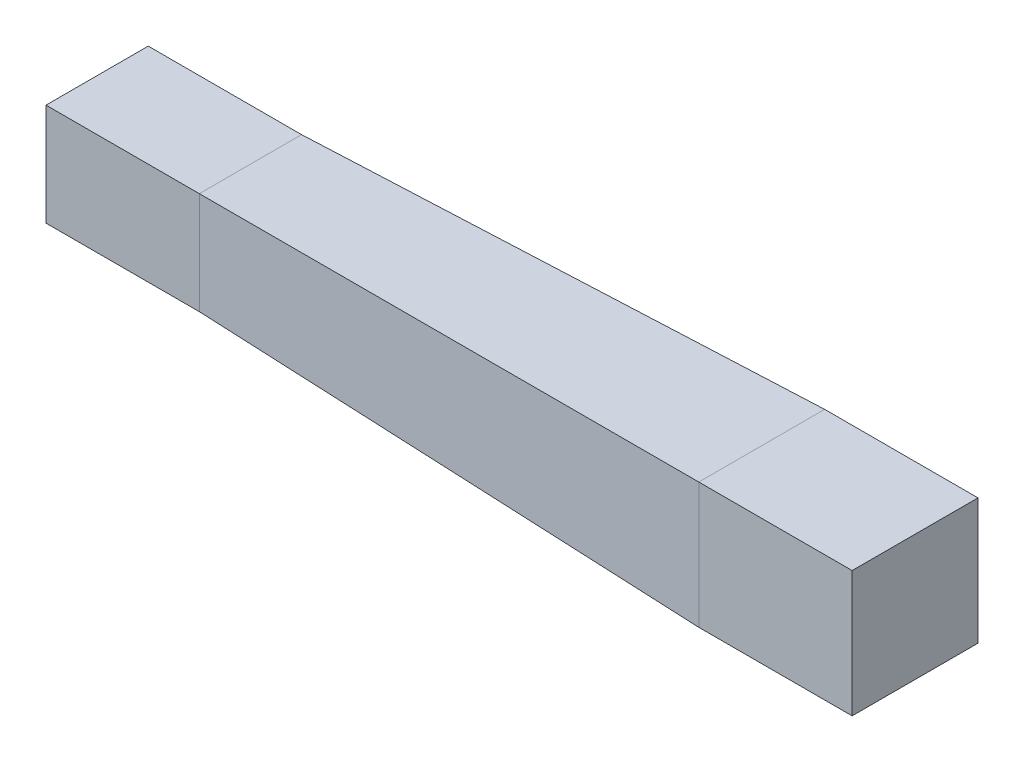
ISO-10303-21;
HEADER;
FILE_DESCRIPTION(('STEP AP214'),'2;1');
FILE_NAME('part.step','',(''),(''),'','','');
FILE_SCHEMA(('AUTOMOTIVE_DESIGN { 1 0 10303 214 1 1 1 1 }'));
ENDSEC;
DATA;
#1=APPLICATION_CONTEXT('core data for automotive mechanical design processes');
#2=APPLICATION_PROTOCOL_DEFINITION('international standard','automotive_design',2000,#1);
#3=PRODUCT_CONTEXT('',#1,'mechanical');
#4=PRODUCT('Part','Part','',(#3));
#5=PRODUCT_RELATED_PRODUCT_CATEGORY('part','',(#4));
#6=PRODUCT_DEFINITION_FORMATION('','',#4);
#7=PRODUCT_DEFINITION_CONTEXT('part definition',#1,'design');
#8=PRODUCT_DEFINITION('design','',#6,#7);
#9=PRODUCT_DEFINITION_SHAPE('','',#8);
#10=(LENGTH_UNIT() NAMED_UNIT(*) SI_UNIT(.MILLI.,.METRE.));
#11=(NAMED_UNIT(*) PLANE_ANGLE_UNIT() SI_UNIT($,.RADIAN.));
#12=(NAMED_UNIT(*) SI_UNIT($,.STERADIAN.) SOLID_ANGLE_UNIT());
#13=UNCERTAINTY_MEASURE_WITH_UNIT(LENGTH_MEASURE(1.E-05),#10,'distance_accuracy_value','');
#14=(GEOMETRIC_REPRESENTATION_CONTEXT(3) GLOBAL_UNCERTAINTY_ASSIGNED_CONTEXT((#13)) GLOBAL_UNIT_ASSIGNED_CONTEXT((#10,
#11,#12)) REPRESENTATION_CONTEXT('',''));
#15=CARTESIAN_POINT('',(0.,0.,0.));
#16=DIRECTION('',(0.,0.,1.));
#17=DIRECTION('',(1.,0.,0.));
#18=AXIS2_PLACEMENT_3D('',#15,#16,#17);
#19=CARTESIAN_POINT('',(1020.85832331262,125.73,125.73));
#20=DIRECTION('',(-0.0231200092502085,0.999732696860651,0.));
#21=DIRECTION('',(0.,0.,-1.));
#22=AXIS2_PLACEMENT_3D('',#19,#20,#21);
#23=PLANE('',#22);
#24=DIRECTION('',(0.,0.,1.));
#25=VECTOR('',#24,1.);
#26=CARTESIAN_POINT('',(1020.85832331262,125.73,125.73));
#27=LINE('',#26,#25);
#28=CARTESIAN_POINT('',(1020.85832331262,125.73,-125.73));
#29=VERTEX_POINT('',#28);
#30=CARTESIAN_POINT('',(1020.85832331262,125.73,125.73));
#31=VERTEX_POINT('',#30);
#32=EDGE_CURVE('E320',#29,#31,#27,.T.);
#33=ORIENTED_EDGE('',*,*,#32,.F.);
#34=CARTESIAN_POINT('',(1020.85832331262,125.73,-125.73));
#35=CARTESIAN_POINT('',(680.378560960894,117.856,-117.856));
#36=CARTESIAN_POINT('',(339.898798609163,109.982,-109.982));
#37=CARTESIAN_POINT('',(-0.580963742567401,102.108,-102.108));
#38=B_SPLINE_CURVE_WITH_KNOTS('',3,(#34,#35,#36,#37),.UNSPECIFIED.,.F.,.F.,(4,4),(0.,1.),.UNSPECIFIED.);
#39=CARTESIAN_POINT('',(-0.580963742567401,102.108,-102.108));
#40=VERTEX_POINT('',#39);
#41=EDGE_CURVE('E248',#29,#40,#38,.T.);
#42=ORIENTED_EDGE('',*,*,#41,.T.);
#43=DIRECTION('',(0.,0.,1.));
#44=VECTOR('',#43,1.);
#45=CARTESIAN_POINT('',(-0.580963742567401,102.108,102.108));
#46=LINE('',#45,#44);
#47=CARTESIAN_POINT('',(-0.580963742567401,102.108,102.108));
#48=VERTEX_POINT('',#47);
#49=EDGE_CURVE('E190',#40,#48,#46,.T.);
#50=ORIENTED_EDGE('',*,*,#49,.T.);
#51=CARTESIAN_POINT('',(1020.85832331262,125.73,125.73));
#52=CARTESIAN_POINT('',(680.378560960894,117.856,117.856));
#53=CARTESIAN_POINT('',(339.898798609163,109.982,109.982));
#54=CARTESIAN_POINT('',(-0.580963742567401,102.108,102.108));
#55=B_SPLINE_CURVE_WITH_KNOTS('',3,(#51,#52,#53,#54),.UNSPECIFIED.,.F.,.F.,(4,4),(0.,1.),.UNSPECIFIED.);
#56=EDGE_CURVE('E239',#31,#48,#55,.T.);
#57=ORIENTED_EDGE('',*,*,#56,.F.);
#58=EDGE_LOOP('',(#33,#42,#50,#57));
#59=FACE_BOUND('',#58,.T.);
#60=ADVANCED_FACE('F115',(#59),#23,.T.);
#61=CARTESIAN_POINT('',(1020.85832331262,-125.73,125.73));
#62=DIRECTION('',(-0.0231200092502084,0.,0.999732696860651));
#63=DIRECTION('',(0.,1.,0.));
#64=AXIS2_PLACEMENT_3D('',#61,#62,#63);
#65=PLANE('',#64);
#66=DIRECTION('',(0.,-1.,0.));
#67=VECTOR('',#66,1.);
#68=CARTESIAN_POINT('',(1020.85832331262,-125.73,125.73));
#69=LINE('',#68,#67);
#70=CARTESIAN_POINT('',(1020.85832331262,-125.73,125.73));
#71=VERTEX_POINT('',#70);
#72=EDGE_CURVE('E141',#31,#71,#69,.T.);
#73=ORIENTED_EDGE('',*,*,#72,.F.);
#74=ORIENTED_EDGE('',*,*,#56,.T.);
#75=DIRECTION('',(0.,-1.,0.));
#76=VECTOR('',#75,1.);
#77=CARTESIAN_POINT('',(-0.580963742567401,-102.108,102.108));
#78=LINE('',#77,#76);
#79=CARTESIAN_POINT('',(-0.580963742567401,-102.108,102.108));
#80=VERTEX_POINT('',#79);
#81=EDGE_CURVE('E120',#48,#80,#78,.T.);
#82=ORIENTED_EDGE('',*,*,#81,.T.);
#83=CARTESIAN_POINT('',(1020.85832331262,-125.73,125.73));
#84=CARTESIAN_POINT('',(680.378560960894,-117.856,117.856));
#85=CARTESIAN_POINT('',(339.898798609163,-109.982,109.982));
#86=CARTESIAN_POINT('',(-0.580963742567401,-102.108,102.108));
#87=B_SPLINE_CURVE_WITH_KNOTS('',3,(#83,#84,#85,#86),.UNSPECIFIED.,.F.,.F.,(4,4),(0.,1.),.UNSPECIFIED.);
#88=EDGE_CURVE('E228',#71,#80,#87,.T.);
#89=ORIENTED_EDGE('',*,*,#88,.F.);
#90=EDGE_LOOP('',(#73,#74,#82,#89));
#91=FACE_BOUND('',#90,.T.);
#92=ADVANCED_FACE('F393',(#91),#65,.T.);
#93=CARTESIAN_POINT('',(1020.85832331262,-125.73,-125.73));
#94=DIRECTION('',(-0.0231200092502084,-0.999732696860651,0.));
#95=DIRECTION('',(0.,0.,1.));
#96=AXIS2_PLACEMENT_3D('',#93,#94,#95);
#97=PLANE('',#96);
#98=DIRECTION('',(0.,0.,-1.));
#99=VECTOR('',#98,1.);
#100=CARTESIAN_POINT('',(1020.85832331262,-125.73,125.73));
#101=LINE('',#100,#99);
#102=CARTESIAN_POINT('',(1020.85832331262,-125.73,-125.73));
#103=VERTEX_POINT('',#102);
#104=EDGE_CURVE('E229',#71,#103,#101,.T.);
#105=ORIENTED_EDGE('',*,*,#104,.F.);
#106=ORIENTED_EDGE('',*,*,#88,.T.);
#107=DIRECTION('',(0.,0.,-1.));
#108=VECTOR('',#107,1.);
#109=CARTESIAN_POINT('',(-0.580963742567401,-102.108,102.108));
#110=LINE('',#109,#108);
#111=CARTESIAN_POINT('',(-0.580963742567401,-102.108,-102.108));
#112=VERTEX_POINT('',#111);
#113=EDGE_CURVE('E13',#80,#112,#110,.T.);
#114=ORIENTED_EDGE('',*,*,#113,.T.);
#115=CARTESIAN_POINT('',(1020.85832331262,-125.73,-125.73));
#116=CARTESIAN_POINT('',(680.378560960894,-117.856,-117.856));
#117=CARTESIAN_POINT('',(339.898798609163,-109.982,-109.982));
#118=CARTESIAN_POINT('',(-0.580963742567401,-102.108,-102.108));
#119=B_SPLINE_CURVE_WITH_KNOTS('',3,(#115,#116,#117,#118),.UNSPECIFIED.,.F.,.F.,(4,4),(0.,1.),.UNSPECIFIED.);
#120=EDGE_CURVE('E225',#103,#112,#119,.T.);
#121=ORIENTED_EDGE('',*,*,#120,.F.);
#122=EDGE_LOOP('',(#105,#106,#114,#121));
#123=FACE_BOUND('',#122,.T.);
#124=ADVANCED_FACE('F428',(#123),#97,.T.);
#125=CARTESIAN_POINT('',(1020.85832331262,125.73,-125.73));
#126=DIRECTION('',(-0.0231200092502084,0.,-0.999732696860651));
#127=DIRECTION('',(0.,-1.,0.));
#128=AXIS2_PLACEMENT_3D('',#125,#126,#127);
#129=PLANE('',#128);
#130=DIRECTION('',(0.,1.,0.));
#131=VECTOR('',#130,1.);
#132=CARTESIAN_POINT('',(1020.85832331262,-125.73,-125.73));
#133=LINE('',#132,#131);
#134=EDGE_CURVE('E328',#103,#29,#133,.T.);
#135=ORIENTED_EDGE('',*,*,#134,.F.);
#136=ORIENTED_EDGE('',*,*,#120,.T.);
#137=DIRECTION('',(0.,1.,0.));
#138=VECTOR('',#137,1.);
#139=CARTESIAN_POINT('',(-0.580963742567401,-102.108,-102.108));
#140=LINE('',#139,#138);
#141=EDGE_CURVE('E258',#112,#40,#140,.T.);
#142=ORIENTED_EDGE('',*,*,#141,.T.);
#143=ORIENTED_EDGE('',*,*,#41,.F.);
#144=EDGE_LOOP('',(#135,#136,#142,#143));
#145=FACE_BOUND('',#144,.T.);
#146=ADVANCED_FACE('F117',(#145),#129,.T.);
#147=CARTESIAN_POINT('',(1327.18232331262,-125.73,-125.73));
#148=DIRECTION('',(0.,0.,1.));
#149=DIRECTION('',(1.,0.,0.));
#150=AXIS2_PLACEMENT_3D('',#147,#148,#149);
#151=PLANE('',#150);
#152=ORIENTED_EDGE('',*,*,#134,.T.);
#153=DIRECTION('',(-1.,0.,0.));
#154=VECTOR('',#153,1.);
#155=CARTESIAN_POINT('',(1327.18232331262,125.73,-125.73));
#156=LINE('',#155,#154);
#157=CARTESIAN_POINT('',(1327.18232331262,125.73,-125.73));
#158=VERTEX_POINT('',#157);
#159=EDGE_CURVE('E329',#158,#29,#156,.T.);
#160=ORIENTED_EDGE('',*,*,#159,.F.);
#161=DIRECTION('',(0.,1.,0.));
#162=VECTOR('',#161,1.);
#163=CARTESIAN_POINT('',(1327.18232331262,-125.73,-125.73));
#164=LINE('',#163,#162);
#165=CARTESIAN_POINT('',(1327.18232331262,-125.73,-125.73));
#166=VERTEX_POINT('',#165);
#167=EDGE_CURVE('E215',#166,#158,#164,.T.);
#168=ORIENTED_EDGE('',*,*,#167,.F.);
#169=DIRECTION('',(-1.,0.,0.));
#170=VECTOR('',#169,1.);
#171=CARTESIAN_POINT('',(1327.18232331262,-125.73,-125.73));
#172=LINE('',#171,#170);
#173=EDGE_CURVE('E224',#166,#103,#172,.T.);
#174=ORIENTED_EDGE('',*,*,#173,.T.);
#175=EDGE_LOOP('',(#152,#160,#168,#174));
#176=FACE_BOUND('',#175,.T.);
#177=ADVANCED_FACE('F309',(#176),#151,.F.);
#178=CARTESIAN_POINT('',(1327.18232331262,125.73,125.73));
#179=DIRECTION('',(0.,-1.,0.));
#180=DIRECTION('',(0.,0.,-1.));
#181=AXIS2_PLACEMENT_3D('',#178,#179,#180);
#182=PLANE('',#181);
#183=ORIENTED_EDGE('',*,*,#32,.T.);
#184=DIRECTION('',(-1.,0.,0.));
#185=VECTOR('',#184,1.);
#186=CARTESIAN_POINT('',(1327.18232331262,125.73,125.73));
#187=LINE('',#186,#185);
#188=CARTESIAN_POINT('',(1327.18232331262,125.73,125.73));
#189=VERTEX_POINT('',#188);
#190=EDGE_CURVE('E281',#189,#31,#187,.T.);
#191=ORIENTED_EDGE('',*,*,#190,.F.);
#192=DIRECTION('',(0.,0.,1.));
#193=VECTOR('',#192,1.);
#194=CARTESIAN_POINT('',(1327.18232331262,125.73,125.73));
#195=LINE('',#194,#193);
#196=EDGE_CURVE('E218',#158,#189,#195,.T.);
#197=ORIENTED_EDGE('',*,*,#196,.F.);
#198=ORIENTED_EDGE('',*,*,#159,.T.);
#199=EDGE_LOOP('',(#183,#191,#197,#198));
#200=FACE_BOUND('',#199,.T.);
#201=ADVANCED_FACE('F303',(#200),#182,.F.);
#202=CARTESIAN_POINT('',(1327.18232331262,-125.73,125.73));
#203=DIRECTION('',(0.,0.,-1.));
#204=DIRECTION('',(-1.,0.,0.));
#205=AXIS2_PLACEMENT_3D('',#202,#203,#204);
#206=PLANE('',#205);
#207=ORIENTED_EDGE('',*,*,#72,.T.);
#208=DIRECTION('',(-1.,0.,0.));
#209=VECTOR('',#208,1.);
#210=CARTESIAN_POINT('',(1327.18232331262,-125.73,125.73));
#211=LINE('',#210,#209);
#212=CARTESIAN_POINT('',(1327.18232331262,-125.73,125.73));
#213=VERTEX_POINT('',#212);
#214=EDGE_CURVE('E278',#213,#71,#211,.T.);
#215=ORIENTED_EDGE('',*,*,#214,.F.);
#216=DIRECTION('',(0.,-1.,0.));
#217=VECTOR('',#216,1.);
#218=CARTESIAN_POINT('',(1327.18232331262,-125.73,125.73));
#219=LINE('',#218,#217);
#220=EDGE_CURVE('E220',#189,#213,#219,.T.);
#221=ORIENTED_EDGE('',*,*,#220,.F.);
#222=ORIENTED_EDGE('',*,*,#190,.T.);
#223=EDGE_LOOP('',(#207,#215,#221,#222));
#224=FACE_BOUND('',#223,.T.);
#225=ADVANCED_FACE('F293',(#224),#206,.F.);
#226=CARTESIAN_POINT('',(1327.18232331262,-125.73,125.73));
#227=DIRECTION('',(0.,1.,0.));
#228=DIRECTION('',(0.,0.,1.));
#229=AXIS2_PLACEMENT_3D('',#226,#227,#228);
#230=PLANE('',#229);
#231=ORIENTED_EDGE('',*,*,#104,.T.);
#232=ORIENTED_EDGE('',*,*,#173,.F.);
#233=DIRECTION('',(0.,0.,-1.));
#234=VECTOR('',#233,1.);
#235=CARTESIAN_POINT('',(1327.18232331262,-125.73,125.73));
#236=LINE('',#235,#234);
#237=EDGE_CURVE('E222',#213,#166,#236,.T.);
#238=ORIENTED_EDGE('',*,*,#237,.F.);
#239=ORIENTED_EDGE('',*,*,#214,.T.);
#240=EDGE_LOOP('',(#231,#232,#238,#239));
#241=FACE_BOUND('',#240,.T.);
#242=ADVANCED_FACE('F302',(#241),#230,.F.);
#243=CARTESIAN_POINT('',(1327.18232331262,0.,0.));
#244=DIRECTION('',(-1.,0.,0.));
#245=DIRECTION('',(0.,0.,1.));
#246=AXIS2_PLACEMENT_3D('',#243,#244,#245);
#247=PLANE('',#246);
#248=ORIENTED_EDGE('',*,*,#167,.T.);
#249=ORIENTED_EDGE('',*,*,#196,.T.);
#250=ORIENTED_EDGE('',*,*,#220,.T.);
#251=ORIENTED_EDGE('',*,*,#237,.T.);
#252=EDGE_LOOP('',(#248,#249,#250,#251));
#253=FACE_BOUND('',#252,.T.);
#254=ADVANCED_FACE('F478',(#253),#247,.F.);
#255=CARTESIAN_POINT('',(-306.904963742567,-102.108,-102.108));
#256=DIRECTION('',(0.,0.,-1.));
#257=DIRECTION('',(-1.,0.,0.));
#258=AXIS2_PLACEMENT_3D('',#255,#256,#257);
#259=PLANE('',#258);
#260=ORIENTED_EDGE('',*,*,#141,.F.);
#261=DIRECTION('',(1.,0.,0.));
#262=VECTOR('',#261,1.);
#263=CARTESIAN_POINT('',(-306.904963742567,-102.108,-102.108));
#264=LINE('',#263,#262);
#265=CARTESIAN_POINT('',(-306.904963742567,-102.108,-102.108));
#266=VERTEX_POINT('',#265);
#267=EDGE_CURVE('E210',#266,#112,#264,.T.);
#268=ORIENTED_EDGE('',*,*,#267,.F.);
#269=DIRECTION('',(0.,1.,0.));
#270=VECTOR('',#269,1.);
#271=CARTESIAN_POINT('',(-306.904963742567,-102.108,-102.108));
#272=LINE('',#271,#270);
#273=CARTESIAN_POINT('',(-306.904963742567,102.108,-102.108));
#274=VERTEX_POINT('',#273);
#275=EDGE_CURVE('E204',#266,#274,#272,.T.);
#276=ORIENTED_EDGE('',*,*,#275,.T.);
#277=DIRECTION('',(1.,0.,0.));
#278=VECTOR('',#277,1.);
#279=CARTESIAN_POINT('',(-306.904963742567,102.108,-102.108));
#280=LINE('',#279,#278);
#281=EDGE_CURVE('E185',#274,#40,#280,.T.);
#282=ORIENTED_EDGE('',*,*,#281,.T.);
#283=EDGE_LOOP('',(#260,#268,#276,#282));
#284=FACE_BOUND('',#283,.T.);
#285=ADVANCED_FACE('F209',(#284),#259,.T.);
#286=CARTESIAN_POINT('',(-306.904963742567,-102.108,102.108));
#287=DIRECTION('',(0.,-1.,0.));
#288=DIRECTION('',(0.,0.,-1.));
#289=AXIS2_PLACEMENT_3D('',#286,#287,#288);
#290=PLANE('',#289);
#291=ORIENTED_EDGE('',*,*,#113,.F.);
#292=DIRECTION('',(1.,0.,0.));
#293=VECTOR('',#292,1.);
#294=CARTESIAN_POINT('',(-306.904963742567,-102.108,102.108));
#295=LINE('',#294,#293);
#296=CARTESIAN_POINT('',(-306.904963742567,-102.108,102.108));
#297=VERTEX_POINT('',#296);
#298=EDGE_CURVE('E487',#297,#80,#295,.T.);
#299=ORIENTED_EDGE('',*,*,#298,.F.);
#300=DIRECTION('',(0.,0.,-1.));
#301=VECTOR('',#300,1.);
#302=CARTESIAN_POINT('',(-306.904963742567,-102.108,102.108));
#303=LINE('',#302,#301);
#304=EDGE_CURVE('E197',#297,#266,#303,.T.);
#305=ORIENTED_EDGE('',*,*,#304,.T.);
#306=ORIENTED_EDGE('',*,*,#267,.T.);
#307=EDGE_LOOP('',(#291,#299,#305,#306));
#308=FACE_BOUND('',#307,.T.);
#309=ADVANCED_FACE('F353',(#308),#290,.T.);
#310=CARTESIAN_POINT('',(-306.904963742567,-102.108,102.108));
#311=DIRECTION('',(0.,0.,1.));
#312=DIRECTION('',(1.,0.,0.));
#313=AXIS2_PLACEMENT_3D('',#310,#311,#312);
#314=PLANE('',#313);
#315=ORIENTED_EDGE('',*,*,#81,.F.);
#316=DIRECTION('',(1.,0.,0.));
#317=VECTOR('',#316,1.);
#318=CARTESIAN_POINT('',(-306.904963742567,102.108,102.108));
#319=LINE('',#318,#317);
#320=CARTESIAN_POINT('',(-306.904963742567,102.108,102.108));
#321=VERTEX_POINT('',#320);
#322=EDGE_CURVE('E196',#321,#48,#319,.T.);
#323=ORIENTED_EDGE('',*,*,#322,.F.);
#324=DIRECTION('',(0.,-1.,0.));
#325=VECTOR('',#324,1.);
#326=CARTESIAN_POINT('',(-306.904963742567,-102.108,102.108));
#327=LINE('',#326,#325);
#328=EDGE_CURVE('E207',#321,#297,#327,.T.);
#329=ORIENTED_EDGE('',*,*,#328,.T.);
#330=ORIENTED_EDGE('',*,*,#298,.T.);
#331=EDGE_LOOP('',(#315,#323,#329,#330));
#332=FACE_BOUND('',#331,.T.);
#333=ADVANCED_FACE('F343',(#332),#314,.T.);
#334=CARTESIAN_POINT('',(-306.904963742567,102.108,102.108));
#335=DIRECTION('',(0.,1.,0.));
#336=DIRECTION('',(0.,0.,1.));
#337=AXIS2_PLACEMENT_3D('',#334,#335,#336);
#338=PLANE('',#337);
#339=ORIENTED_EDGE('',*,*,#49,.F.);
#340=ORIENTED_EDGE('',*,*,#281,.F.);
#341=DIRECTION('',(0.,0.,1.));
#342=VECTOR('',#341,1.);
#343=CARTESIAN_POINT('',(-306.904963742567,102.108,102.108));
#344=LINE('',#343,#342);
#345=EDGE_CURVE('E188',#274,#321,#344,.T.);
#346=ORIENTED_EDGE('',*,*,#345,.T.);
#347=ORIENTED_EDGE('',*,*,#322,.T.);
#348=EDGE_LOOP('',(#339,#340,#346,#347));
#349=FACE_BOUND('',#348,.T.);
#350=ADVANCED_FACE('F187',(#349),#338,.T.);
#351=CARTESIAN_POINT('',(-306.904963742567,0.,0.));
#352=DIRECTION('',(-1.,0.,0.));
#353=DIRECTION('',(0.,0.,1.));
#354=AXIS2_PLACEMENT_3D('',#351,#352,#353);
#355=PLANE('',#354);
#356=ORIENTED_EDGE('',*,*,#275,.F.);
#357=ORIENTED_EDGE('',*,*,#304,.F.);
#358=ORIENTED_EDGE('',*,*,#328,.F.);
#359=ORIENTED_EDGE('',*,*,#345,.F.);
#360=EDGE_LOOP('',(#356,#357,#358,#359));
#361=FACE_BOUND('',#360,.T.);
#362=ADVANCED_FACE('F202',(#361),#355,.T.);
#363=CLOSED_SHELL('',(#60,#92,#124,#146,#177,#201,#225,#242,#254,#285,#309,#333,#350,#362));
#364=MANIFOLD_SOLID_BREP('B2',#363);
#365=ADVANCED_BREP_SHAPE_REPRESENTATION('',(#18,#364),#14);
#366=SHAPE_DEFINITION_REPRESENTATION(#9,#365);
ENDSEC;
END-ISO-10303-21;
